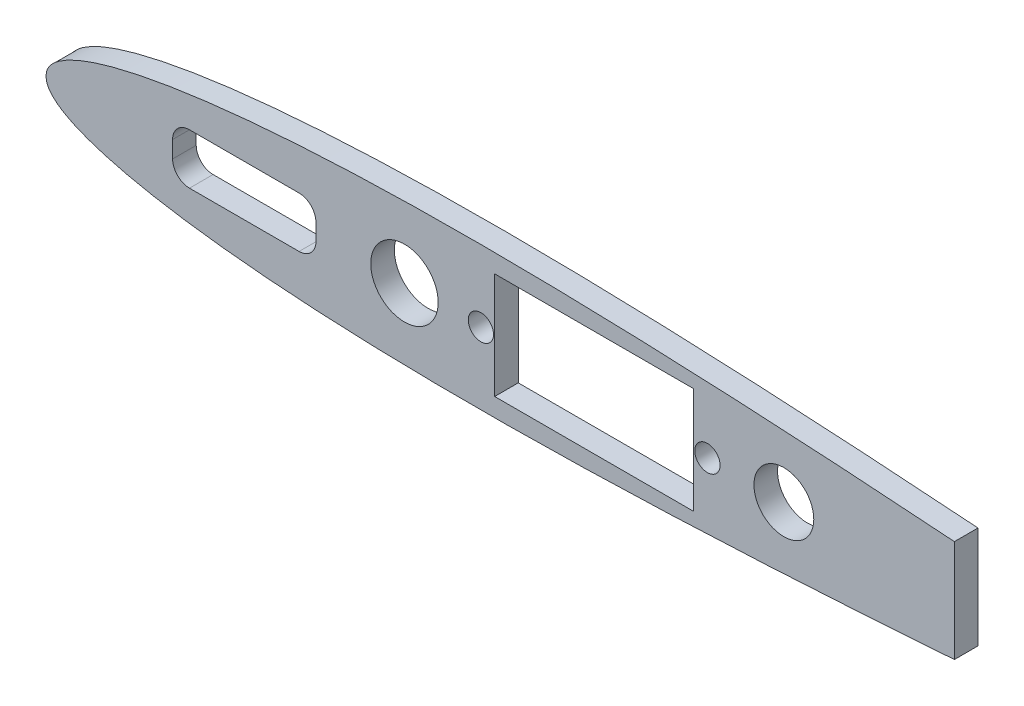
ISO-10303-21;
HEADER;
FILE_DESCRIPTION(('STEP AP214'),'2;1');
FILE_NAME('part.step','',(''),(''),'','','');
FILE_SCHEMA(('AUTOMOTIVE_DESIGN { 1 0 10303 214 1 1 1 1 }'));
ENDSEC;
DATA;
#1=APPLICATION_CONTEXT('core data for automotive mechanical design processes');
#2=APPLICATION_PROTOCOL_DEFINITION('international standard','automotive_design',2000,#1);
#3=PRODUCT_CONTEXT('',#1,'mechanical');
#4=PRODUCT('Part','Part','',(#3));
#5=PRODUCT_RELATED_PRODUCT_CATEGORY('part','',(#4));
#6=PRODUCT_DEFINITION_FORMATION('','',#4);
#7=PRODUCT_DEFINITION_CONTEXT('part definition',#1,'design');
#8=PRODUCT_DEFINITION('design','',#6,#7);
#9=PRODUCT_DEFINITION_SHAPE('','',#8);
#10=(LENGTH_UNIT() NAMED_UNIT(*) SI_UNIT(.MILLI.,.METRE.));
#11=(NAMED_UNIT(*) PLANE_ANGLE_UNIT() SI_UNIT($,.RADIAN.));
#12=(NAMED_UNIT(*) SI_UNIT($,.STERADIAN.) SOLID_ANGLE_UNIT());
#13=UNCERTAINTY_MEASURE_WITH_UNIT(LENGTH_MEASURE(1.E-05),#10,'distance_accuracy_value','');
#14=(GEOMETRIC_REPRESENTATION_CONTEXT(3) GLOBAL_UNCERTAINTY_ASSIGNED_CONTEXT((#13)) GLOBAL_UNIT_ASSIGNED_CONTEXT((#10,
#11,#12)) REPRESENTATION_CONTEXT('',''));
#15=CARTESIAN_POINT('',(0.,0.,0.));
#16=DIRECTION('',(0.,0.,1.));
#17=DIRECTION('',(1.,0.,0.));
#18=AXIS2_PLACEMENT_3D('',#15,#16,#17);
#19=CARTESIAN_POINT('',(217.74763411893,0.,1.4));
#20=DIRECTION('',(1.,0.,0.));
#21=DIRECTION('',(0.,0.,-1.));
#22=AXIS2_PLACEMENT_3D('',#19,#20,#21);
#23=PLANE('',#22);
#24=DIRECTION('',(0.,-1.,0.));
#25=VECTOR('',#24,1.);
#26=CARTESIAN_POINT('',(217.74763411893,0.,-1.4));
#27=LINE('',#26,#25);
#28=CARTESIAN_POINT('',(217.74763411893,6.05811307778919,-1.4));
#29=VERTEX_POINT('',#28);
#30=CARTESIAN_POINT('',(217.74763411893,-6.05811307778918,-1.4));
#31=VERTEX_POINT('',#30);
#32=EDGE_CURVE('E153',#29,#31,#27,.T.);
#33=ORIENTED_EDGE('',*,*,#32,.F.);
#34=DIRECTION('',(0.,0.,-1.));
#35=VECTOR('',#34,1.);
#36=CARTESIAN_POINT('',(217.74763411893,6.05811307778919,1.4));
#37=LINE('',#36,#35);
#38=CARTESIAN_POINT('',(217.74763411893,6.05811307778919,1.4));
#39=VERTEX_POINT('',#38);
#40=EDGE_CURVE('E11',#39,#29,#37,.T.);
#41=ORIENTED_EDGE('',*,*,#40,.F.);
#42=DIRECTION('',(0.,-1.,0.));
#43=VECTOR('',#42,1.);
#44=CARTESIAN_POINT('',(217.74763411893,0.,1.4));
#45=LINE('',#44,#43);
#46=CARTESIAN_POINT('',(217.74763411893,-6.05811307778918,1.4));
#47=VERTEX_POINT('',#46);
#48=EDGE_CURVE('E152',#39,#47,#45,.T.);
#49=ORIENTED_EDGE('',*,*,#48,.T.);
#50=DIRECTION('',(0.,0.,-1.));
#51=VECTOR('',#50,1.);
#52=CARTESIAN_POINT('',(217.74763411893,-6.05811307778918,1.4));
#53=LINE('',#52,#51);
#54=EDGE_CURVE('E110',#47,#31,#53,.T.);
#55=ORIENTED_EDGE('',*,*,#54,.T.);
#56=EDGE_LOOP('',(#33,#41,#49,#55));
#57=FACE_BOUND('',#56,.T.);
#58=ADVANCED_FACE('F35',(#57),#23,.T.);
#59=CARTESIAN_POINT('',(280.,0.1785,1.4));
#60=CARTESIAN_POINT('',(279.592043703671,0.226075897783467,1.4));
#61=CARTESIAN_POINT('',(278.452596210234,0.358958360844463,1.4));
#62=CARTESIAN_POINT('',(276.385426802208,0.596436481937331,1.4));
#63=CARTESIAN_POINT('',(273.651166983567,0.905304265461348,1.4));
#64=CARTESIAN_POINT('',(270.455833183168,1.25859090467058,1.4));
#65=CARTESIAN_POINT('',(266.898988861825,1.64260730411104,1.4));
#66=CARTESIAN_POINT('',(263.047743378214,2.04785660385741,1.4));
#67=CARTESIAN_POINT('',(258.952644661846,2.46718813772148,1.4));
#68=CARTESIAN_POINT('',(253.11611192075,3.04786904369115,1.4));
#69=CARTESIAN_POINT('',(247.071089235748,3.62220530992837,1.4));
#70=CARTESIAN_POINT('',(240.854179313273,4.18491264898859,1.4));
#71=CARTESIAN_POINT('',(236.038226964104,4.60581174883637,1.4));
#72=CARTESIAN_POINT('',(231.150377302514,5.0173511026198,1.4));
#73=CARTESIAN_POINT('',(226.209311113549,5.41695826474113,1.4));
#74=CARTESIAN_POINT('',(221.232257466585,5.802244474926,1.4));
#75=CARTESIAN_POINT('',(216.235178286272,6.17086457697306,1.4));
#76=CARTESIAN_POINT('',(211.232977593233,6.52047434958791,1.4));
#77=CARTESIAN_POINT('',(206.239642946259,6.84887299963153,1.4));
#78=CARTESIAN_POINT('',(201.268368916985,7.15382688632495,1.4));
#79=CARTESIAN_POINT('',(196.331634567492,7.43310533690328,1.4));
#80=CARTESIAN_POINT('',(191.441311474098,7.68460443906704,1.4));
#81=CARTESIAN_POINT('',(186.608700126931,7.90621829286941,1.4));
#82=CARTESIAN_POINT('',(181.844626933159,8.09595849303594,1.4));
#83=CARTESIAN_POINT('',(177.159453511195,8.25195768192942,1.4));
#84=CARTESIAN_POINT('',(172.563150271755,8.37248656398387,1.4));
#85=CARTESIAN_POINT('',(168.065295924147,8.45595366245417,1.4));
#86=CARTESIAN_POINT('',(163.675147454163,8.5010026998616,1.4));
#87=CARTESIAN_POINT('',(159.401643403725,8.50652296727326,1.4));
#88=CARTESIAN_POINT('',(155.253439755899,8.47152880790102,1.4));
#89=CARTESIAN_POINT('',(151.238917925322,8.39550607585732,1.4));
#90=CARTESIAN_POINT('',(147.366223919106,8.27798597685019,1.4));
#91=CARTESIAN_POINT('',(143.643266298458,8.11897556141504,1.4));
#92=CARTESIAN_POINT('',(140.077743555427,7.91867894287145,1.4));
#93=CARTESIAN_POINT('',(136.677139412155,7.67760454203032,1.4));
#94=CARTESIAN_POINT('',(133.44876289533,7.39648056861162,1.4));
#95=CARTESIAN_POINT('',(130.399721685833,7.07642431038863,1.4));
#96=CARTESIAN_POINT('',(127.536961088608,6.71865034112428,1.4));
#97=CARTESIAN_POINT('',(124.867245825052,6.32466607739586,1.4));
#98=CARTESIAN_POINT('',(122.397158973637,5.89612056643678,1.4));
#99=CARTESIAN_POINT('',(120.133109351335,5.43479747619412,1.4));
#100=CARTESIAN_POINT('',(118.081312132678,4.94256764101073,1.4));
#101=CARTESIAN_POINT('',(116.247665797811,4.42139238611828,1.4));
#102=CARTESIAN_POINT('',(114.637939719778,3.87306046577258,1.4));
#103=CARTESIAN_POINT('',(113.256788366372,3.29930923783808,1.4));
#104=CARTESIAN_POINT('',(112.109835923497,2.70130638754162,1.4));
#105=CARTESIAN_POINT('',(111.196336340545,2.07855523302877,1.4));
#106=CARTESIAN_POINT('',(110.530223641577,1.42706975809109,1.4));
#107=CARTESIAN_POINT('',(110.085538217979,0.734230220465984,1.4));
#108=CARTESIAN_POINT('',(110.027578175867,0.236721440142773,1.4));
#109=CARTESIAN_POINT('',(110.,0.,1.4));
#110=B_SPLINE_CURVE_WITH_KNOTS('',3,(#59,#60,#61,#62,#63,#64,#65,#66,#67,#68,#69,#70,#71,#72,
#73,#74,#75,#76,#77,#78,#79,#80,#81,#82,#83,#84,#85,#86,#87,#88,#89,#90,#91,#92,#93,#94,#95,#96,
#97,#98,#99,#100,#101,#102,#103,#104,#105,#106,#107,#108,#109),.UNSPECIFIED.,.F.,.F.,(4,1,1,1,1,
1,1,1,1,1,1,1,1,1,1,1,1,1,1,1,1,1,1,1,1,1,1,1,1,1,1,1,1,1,1,1,1,1,1,1,1,1,1,1,1,1,1,1,4),(0.,
0.00714472364101537,0.0199556607345446,0.0361960612227423,0.0550111837630616,0.0758789375062231,
0.0984288660950085,0.122375554002083,0.147487885417653,0.200459747132314,0.228005170188377,
0.256076453638138,0.284555151070125,0.31333276259982,0.342309553949656,0.371392651251454,
0.400495752426115,0.429537687145242,0.458441905920554,0.487136113386761,0.515551917136779,
0.543623846405843,0.571289984327897,0.598490809568145,0.625169613225281,0.651272029103837,
0.676746157949116,0.701541790883913,0.725611016556625,0.74890783507394,0.771387785068823,
0.793008138575143,0.813728032856974,0.833507815357633,0.852309696093785,0.870097310144046,
0.886835918069106,0.902492781713446,0.917037139140432,0.930441053860646,0.942679762162792,
0.953733567025024,0.963589785484808,0.97224701929817,0.979722225388436,0.986065145275041,
0.991385258303778,0.995900988803729,1.),.UNSPECIFIED.);
#111=DIRECTION('',(0.,0.,-1.));
#112=VECTOR('',#111,1.);
#113=SURFACE_OF_LINEAR_EXTRUSION('',#110,#112);
#114=CARTESIAN_POINT('',(280.,0.1785,-1.4));
#115=CARTESIAN_POINT('',(279.592043703671,0.226075897783467,-1.4));
#116=CARTESIAN_POINT('',(278.452596210234,0.358958360844463,-1.4));
#117=CARTESIAN_POINT('',(276.385426802208,0.596436481937331,-1.4));
#118=CARTESIAN_POINT('',(273.651166983567,0.905304265461348,-1.4));
#119=CARTESIAN_POINT('',(270.455833183168,1.25859090467058,-1.4));
#120=CARTESIAN_POINT('',(266.898988861825,1.64260730411104,-1.4));
#121=CARTESIAN_POINT('',(263.047743378214,2.04785660385741,-1.4));
#122=CARTESIAN_POINT('',(258.952644661846,2.46718813772148,-1.4));
#123=CARTESIAN_POINT('',(253.11611192075,3.04786904369115,-1.4));
#124=CARTESIAN_POINT('',(247.071089235748,3.62220530992837,-1.4));
#125=CARTESIAN_POINT('',(240.854179313273,4.18491264898859,-1.4));
#126=CARTESIAN_POINT('',(236.038226964104,4.60581174883637,-1.4));
#127=CARTESIAN_POINT('',(231.150377302514,5.0173511026198,-1.4));
#128=CARTESIAN_POINT('',(226.209311113549,5.41695826474113,-1.4));
#129=CARTESIAN_POINT('',(221.232257466585,5.802244474926,-1.4));
#130=CARTESIAN_POINT('',(216.235178286272,6.17086457697306,-1.4));
#131=CARTESIAN_POINT('',(211.232977593233,6.52047434958791,-1.4));
#132=CARTESIAN_POINT('',(206.239642946259,6.84887299963153,-1.4));
#133=CARTESIAN_POINT('',(201.268368916985,7.15382688632495,-1.4));
#134=CARTESIAN_POINT('',(196.331634567492,7.43310533690328,-1.4));
#135=CARTESIAN_POINT('',(191.441311474098,7.68460443906704,-1.4));
#136=CARTESIAN_POINT('',(186.608700126931,7.90621829286941,-1.4));
#137=CARTESIAN_POINT('',(181.844626933159,8.09595849303594,-1.4));
#138=CARTESIAN_POINT('',(177.159453511195,8.25195768192942,-1.4));
#139=CARTESIAN_POINT('',(172.563150271755,8.37248656398387,-1.4));
#140=CARTESIAN_POINT('',(168.065295924147,8.45595366245417,-1.4));
#141=CARTESIAN_POINT('',(163.675147454163,8.5010026998616,-1.4));
#142=CARTESIAN_POINT('',(159.401643403725,8.50652296727326,-1.4));
#143=CARTESIAN_POINT('',(155.253439755899,8.47152880790102,-1.4));
#144=CARTESIAN_POINT('',(151.238917925322,8.39550607585732,-1.4));
#145=CARTESIAN_POINT('',(147.366223919106,8.27798597685019,-1.4));
#146=CARTESIAN_POINT('',(143.643266298458,8.11897556141504,-1.4));
#147=CARTESIAN_POINT('',(140.077743555427,7.91867894287145,-1.4));
#148=CARTESIAN_POINT('',(136.677139412155,7.67760454203032,-1.4));
#149=CARTESIAN_POINT('',(133.44876289533,7.39648056861162,-1.4));
#150=CARTESIAN_POINT('',(130.399721685833,7.07642431038863,-1.4));
#151=CARTESIAN_POINT('',(127.536961088608,6.71865034112428,-1.4));
#152=CARTESIAN_POINT('',(124.867245825052,6.32466607739586,-1.4));
#153=CARTESIAN_POINT('',(122.397158973637,5.89612056643678,-1.4));
#154=CARTESIAN_POINT('',(120.133109351335,5.43479747619412,-1.4));
#155=CARTESIAN_POINT('',(118.081312132678,4.94256764101073,-1.4));
#156=CARTESIAN_POINT('',(116.247665797811,4.42139238611828,-1.4));
#157=CARTESIAN_POINT('',(114.637939719778,3.87306046577258,-1.4));
#158=CARTESIAN_POINT('',(113.256788366372,3.29930923783808,-1.4));
#159=CARTESIAN_POINT('',(112.109835923497,2.70130638754162,-1.4));
#160=CARTESIAN_POINT('',(111.196336340545,2.07855523302877,-1.4));
#161=CARTESIAN_POINT('',(110.530223641577,1.42706975809109,-1.4));
#162=CARTESIAN_POINT('',(110.085538217979,0.734230220465984,-1.4));
#163=CARTESIAN_POINT('',(110.027578175867,0.236721440142773,-1.4));
#164=CARTESIAN_POINT('',(110.,0.,-1.4));
#165=B_SPLINE_CURVE_WITH_KNOTS('',3,(#114,#115,#116,#117,#118,#119,#120,#121,#122,#123,#124,
#125,#126,#127,#128,#129,#130,#131,#132,#133,#134,#135,#136,#137,#138,#139,#140,#141,#142,#143,
#144,#145,#146,#147,#148,#149,#150,#151,#152,#153,#154,#155,#156,#157,#158,#159,#160,#161,#162,
#163,#164),.UNSPECIFIED.,.F.,.F.,(4,1,1,1,1,1,1,1,1,1,1,1,1,1,1,1,1,1,1,1,1,1,1,1,1,1,1,1,1,1,1,
1,1,1,1,1,1,1,1,1,1,1,1,1,1,1,1,1,4),(0.,0.00714472364101537,0.0199556607345446,
0.0361960612227423,0.0550111837630616,0.0758789375062231,0.0984288660950085,0.122375554002083,
0.147487885417653,0.200459747132314,0.228005170188377,0.256076453638138,0.284555151070125,
0.31333276259982,0.342309553949656,0.371392651251454,0.400495752426115,0.429537687145242,
0.458441905920554,0.487136113386761,0.515551917136779,0.543623846405843,0.571289984327897,
0.598490809568145,0.625169613225281,0.651272029103837,0.676746157949116,0.701541790883913,
0.725611016556625,0.74890783507394,0.771387785068823,0.793008138575143,0.813728032856974,
0.833507815357633,0.852309696093785,0.870097310144046,0.886835918069106,0.902492781713446,
0.917037139140432,0.930441053860646,0.942679762162792,0.953733567025024,0.963589785484808,
0.97224701929817,0.979722225388436,0.986065145275041,0.991385258303778,0.995900988803729,1.),.UNSPECIFIED.);
#166=CARTESIAN_POINT('',(110.,0.,-1.4));
#167=VERTEX_POINT('',#166);
#168=EDGE_CURVE('E298',#29,#167,#165,.T.);
#169=ORIENTED_EDGE('',*,*,#168,.T.);
#170=DIRECTION('',(0.,0.,-1.));
#171=VECTOR('',#170,1.);
#172=CARTESIAN_POINT('',(110.,0.,1.4));
#173=LINE('',#172,#171);
#174=CARTESIAN_POINT('',(110.,0.,1.4));
#175=VERTEX_POINT('',#174);
#176=EDGE_CURVE('E45',#175,#167,#173,.T.);
#177=ORIENTED_EDGE('',*,*,#176,.F.);
#178=EDGE_CURVE('E157',#39,#175,#110,.T.);
#179=ORIENTED_EDGE('',*,*,#178,.F.);
#180=ORIENTED_EDGE('',*,*,#40,.T.);
#181=EDGE_LOOP('',(#169,#177,#179,#180));
#182=FACE_BOUND('',#181,.T.);
#183=ADVANCED_FACE('F158',(#182),#113,.F.);
#184=CARTESIAN_POINT('',(0.,3.,1.4));
#185=DIRECTION('',(0.,1.,0.));
#186=DIRECTION('',(0.,0.,1.));
#187=AXIS2_PLACEMENT_3D('',#184,#185,#186);
#188=PLANE('',#187);
#189=DIRECTION('',(1.,0.,0.));
#190=VECTOR('',#189,1.);
#191=CARTESIAN_POINT('',(0.,3.,-1.4));
#192=LINE('',#191,#190);
#193=CARTESIAN_POINT('',(127.018484280221,3.,-1.4));
#194=VERTEX_POINT('',#193);
#195=CARTESIAN_POINT('',(140.018484280221,3.,-1.4));
#196=VERTEX_POINT('',#195);
#197=EDGE_CURVE('E276',#194,#196,#192,.T.);
#198=ORIENTED_EDGE('',*,*,#197,.T.);
#199=DIRECTION('',(0.,0.,-1.));
#200=VECTOR('',#199,1.);
#201=CARTESIAN_POINT('',(140.018484280221,3.,1.4));
#202=LINE('',#201,#200);
#203=CARTESIAN_POINT('',(140.018484280221,3.,1.4));
#204=VERTEX_POINT('',#203);
#205=EDGE_CURVE('E313',#204,#196,#202,.T.);
#206=ORIENTED_EDGE('',*,*,#205,.F.);
#207=DIRECTION('',(1.,0.,0.));
#208=VECTOR('',#207,1.);
#209=CARTESIAN_POINT('',(0.,3.,1.4));
#210=LINE('',#209,#208);
#211=CARTESIAN_POINT('',(127.018484280221,3.,1.4));
#212=VERTEX_POINT('',#211);
#213=EDGE_CURVE('E354',#212,#204,#210,.T.);
#214=ORIENTED_EDGE('',*,*,#213,.F.);
#215=DIRECTION('',(0.,0.,-1.));
#216=VECTOR('',#215,1.);
#217=CARTESIAN_POINT('',(127.018484280221,3.,1.4));
#218=LINE('',#217,#216);
#219=EDGE_CURVE('E315',#212,#194,#218,.T.);
#220=ORIENTED_EDGE('',*,*,#219,.T.);
#221=EDGE_LOOP('',(#198,#206,#214,#220));
#222=FACE_BOUND('',#221,.T.);
#223=ADVANCED_FACE('F181',(#222),#188,.F.);
#224=CARTESIAN_POINT('',(140.018484280221,1.,1.4));
#225=DIRECTION('',(0.,0.,-1.));
#226=DIRECTION('',(-1.,0.,0.));
#227=AXIS2_PLACEMENT_3D('',#224,#225,#226);
#228=CYLINDRICAL_SURFACE('',#227,2.);
#229=CARTESIAN_POINT('',(140.018484280221,1.,-1.4));
#230=DIRECTION('',(0.,0.,1.));
#231=DIRECTION('',(1.,0.,0.));
#232=AXIS2_PLACEMENT_3D('',#229,#230,#231);
#233=CIRCLE('',#232,2.);
#234=CARTESIAN_POINT('',(142.018484280221,0.999999999999986,-1.4));
#235=VERTEX_POINT('',#234);
#236=EDGE_CURVE('E279',#196,#235,#233,.F.);
#237=ORIENTED_EDGE('',*,*,#236,.T.);
#238=DIRECTION('',(0.,0.,-1.));
#239=VECTOR('',#238,1.);
#240=CARTESIAN_POINT('',(142.018484280221,0.999999999999986,1.4));
#241=LINE('',#240,#239);
#242=CARTESIAN_POINT('',(142.018484280221,0.999999999999986,1.4));
#243=VERTEX_POINT('',#242);
#244=EDGE_CURVE('E330',#243,#235,#241,.T.);
#245=ORIENTED_EDGE('',*,*,#244,.F.);
#246=CARTESIAN_POINT('',(140.018484280221,1.,1.4));
#247=DIRECTION('',(0.,0.,1.));
#248=DIRECTION('',(1.,0.,0.));
#249=AXIS2_PLACEMENT_3D('',#246,#247,#248);
#250=CIRCLE('',#249,2.);
#251=EDGE_CURVE('E364',#204,#243,#250,.F.);
#252=ORIENTED_EDGE('',*,*,#251,.F.);
#253=ORIENTED_EDGE('',*,*,#205,.T.);
#254=EDGE_LOOP('',(#237,#245,#252,#253));
#255=FACE_BOUND('',#254,.T.);
#256=ADVANCED_FACE('F212',(#255),#228,.F.);
#257=CARTESIAN_POINT('',(142.018484280221,0.,1.4));
#258=DIRECTION('',(-1.,0.,0.));
#259=DIRECTION('',(0.,0.,1.));
#260=AXIS2_PLACEMENT_3D('',#257,#258,#259);
#261=PLANE('',#260);
#262=DIRECTION('',(0.,1.,0.));
#263=VECTOR('',#262,1.);
#264=CARTESIAN_POINT('',(142.018484280221,0.,-1.4));
#265=LINE('',#264,#263);
#266=CARTESIAN_POINT('',(142.018484280221,-0.999999999999985,-1.4));
#267=VERTEX_POINT('',#266);
#268=EDGE_CURVE('E282',#267,#235,#265,.T.);
#269=ORIENTED_EDGE('',*,*,#268,.F.);
#270=DIRECTION('',(0.,0.,-1.));
#271=VECTOR('',#270,1.);
#272=CARTESIAN_POINT('',(142.018484280221,-0.999999999999985,1.4));
#273=LINE('',#272,#271);
#274=CARTESIAN_POINT('',(142.018484280221,-0.999999999999985,1.4));
#275=VERTEX_POINT('',#274);
#276=EDGE_CURVE('E328',#275,#267,#273,.T.);
#277=ORIENTED_EDGE('',*,*,#276,.F.);
#278=DIRECTION('',(0.,1.,0.));
#279=VECTOR('',#278,1.);
#280=CARTESIAN_POINT('',(142.018484280221,0.,1.4));
#281=LINE('',#280,#279);
#282=EDGE_CURVE('E366',#275,#243,#281,.T.);
#283=ORIENTED_EDGE('',*,*,#282,.T.);
#284=ORIENTED_EDGE('',*,*,#244,.T.);
#285=EDGE_LOOP('',(#269,#277,#283,#284));
#286=FACE_BOUND('',#285,.T.);
#287=ADVANCED_FACE('F208',(#286),#261,.T.);
#288=CARTESIAN_POINT('',(140.018484280221,-1.,1.4));
#289=DIRECTION('',(0.,0.,-1.));
#290=DIRECTION('',(-1.,0.,0.));
#291=AXIS2_PLACEMENT_3D('',#288,#289,#290);
#292=CYLINDRICAL_SURFACE('',#291,2.);
#293=CARTESIAN_POINT('',(140.018484280221,-1.,-1.4));
#294=DIRECTION('',(0.,0.,1.));
#295=DIRECTION('',(1.,0.,0.));
#296=AXIS2_PLACEMENT_3D('',#293,#294,#295);
#297=CIRCLE('',#296,2.);
#298=CARTESIAN_POINT('',(140.018484280221,-3.,-1.4));
#299=VERTEX_POINT('',#298);
#300=EDGE_CURVE('E285',#299,#267,#297,.T.);
#301=ORIENTED_EDGE('',*,*,#300,.F.);
#302=DIRECTION('',(0.,0.,-1.));
#303=VECTOR('',#302,1.);
#304=CARTESIAN_POINT('',(140.018484280221,-3.,1.4));
#305=LINE('',#304,#303);
#306=CARTESIAN_POINT('',(140.018484280221,-3.,1.4));
#307=VERTEX_POINT('',#306);
#308=EDGE_CURVE('E326',#307,#299,#305,.T.);
#309=ORIENTED_EDGE('',*,*,#308,.F.);
#310=CARTESIAN_POINT('',(140.018484280221,-1.,1.4));
#311=DIRECTION('',(0.,0.,1.));
#312=DIRECTION('',(1.,0.,0.));
#313=AXIS2_PLACEMENT_3D('',#310,#311,#312);
#314=CIRCLE('',#313,2.);
#315=EDGE_CURVE('E369',#307,#275,#314,.T.);
#316=ORIENTED_EDGE('',*,*,#315,.T.);
#317=ORIENTED_EDGE('',*,*,#276,.T.);
#318=EDGE_LOOP('',(#301,#309,#316,#317));
#319=FACE_BOUND('',#318,.T.);
#320=ADVANCED_FACE('F204',(#319),#292,.F.);
#321=CARTESIAN_POINT('',(0.,-3.,1.4));
#322=DIRECTION('',(0.,1.,0.));
#323=DIRECTION('',(0.,0.,1.));
#324=AXIS2_PLACEMENT_3D('',#321,#322,#323);
#325=PLANE('',#324);
#326=DIRECTION('',(1.,0.,0.));
#327=VECTOR('',#326,1.);
#328=CARTESIAN_POINT('',(0.,-3.,-1.4));
#329=LINE('',#328,#327);
#330=CARTESIAN_POINT('',(127.018484280221,-3.,-1.4));
#331=VERTEX_POINT('',#330);
#332=EDGE_CURVE('E288',#331,#299,#329,.T.);
#333=ORIENTED_EDGE('',*,*,#332,.F.);
#334=DIRECTION('',(0.,0.,-1.));
#335=VECTOR('',#334,1.);
#336=CARTESIAN_POINT('',(127.018484280221,-3.,1.4));
#337=LINE('',#336,#335);
#338=CARTESIAN_POINT('',(127.018484280221,-3.,1.4));
#339=VERTEX_POINT('',#338);
#340=EDGE_CURVE('E324',#339,#331,#337,.T.);
#341=ORIENTED_EDGE('',*,*,#340,.F.);
#342=DIRECTION('',(1.,0.,0.));
#343=VECTOR('',#342,1.);
#344=CARTESIAN_POINT('',(0.,-3.,1.4));
#345=LINE('',#344,#343);
#346=EDGE_CURVE('E372',#339,#307,#345,.T.);
#347=ORIENTED_EDGE('',*,*,#346,.T.);
#348=ORIENTED_EDGE('',*,*,#308,.T.);
#349=EDGE_LOOP('',(#333,#341,#347,#348));
#350=FACE_BOUND('',#349,.T.);
#351=ADVANCED_FACE('F200',(#350),#325,.T.);
#352=CARTESIAN_POINT('',(127.018484280221,-1.,1.4));
#353=DIRECTION('',(0.,0.,-1.));
#354=DIRECTION('',(-1.,0.,0.));
#355=AXIS2_PLACEMENT_3D('',#352,#353,#354);
#356=CYLINDRICAL_SURFACE('',#355,2.);
#357=CARTESIAN_POINT('',(127.018484280221,-1.,-1.4));
#358=DIRECTION('',(0.,0.,1.));
#359=DIRECTION('',(1.,0.,0.));
#360=AXIS2_PLACEMENT_3D('',#357,#358,#359);
#361=CIRCLE('',#360,2.);
#362=CARTESIAN_POINT('',(125.018484280221,-0.999999999999985,-1.4));
#363=VERTEX_POINT('',#362);
#364=EDGE_CURVE('E291',#331,#363,#361,.F.);
#365=ORIENTED_EDGE('',*,*,#364,.T.);
#366=DIRECTION('',(0.,0.,-1.));
#367=VECTOR('',#366,1.);
#368=CARTESIAN_POINT('',(125.018484280221,-0.999999999999985,1.4));
#369=LINE('',#368,#367);
#370=CARTESIAN_POINT('',(125.018484280221,-0.999999999999985,1.4));
#371=VERTEX_POINT('',#370);
#372=EDGE_CURVE('E321',#371,#363,#369,.T.);
#373=ORIENTED_EDGE('',*,*,#372,.F.);
#374=CARTESIAN_POINT('',(127.018484280221,-1.,1.4));
#375=DIRECTION('',(0.,0.,1.));
#376=DIRECTION('',(1.,0.,0.));
#377=AXIS2_PLACEMENT_3D('',#374,#375,#376);
#378=CIRCLE('',#377,2.);
#379=EDGE_CURVE('E375',#339,#371,#378,.F.);
#380=ORIENTED_EDGE('',*,*,#379,.F.);
#381=ORIENTED_EDGE('',*,*,#340,.T.);
#382=EDGE_LOOP('',(#365,#373,#380,#381));
#383=FACE_BOUND('',#382,.T.);
#384=ADVANCED_FACE('F196',(#383),#356,.F.);
#385=CARTESIAN_POINT('',(125.018484280221,0.,1.4));
#386=DIRECTION('',(-1.,0.,0.));
#387=DIRECTION('',(0.,0.,1.));
#388=AXIS2_PLACEMENT_3D('',#385,#386,#387);
#389=PLANE('',#388);
#390=DIRECTION('',(0.,1.,0.));
#391=VECTOR('',#390,1.);
#392=CARTESIAN_POINT('',(125.018484280221,0.,-1.4));
#393=LINE('',#392,#391);
#394=CARTESIAN_POINT('',(125.018484280221,0.999999999999986,-1.4));
#395=VERTEX_POINT('',#394);
#396=EDGE_CURVE('E293',#363,#395,#393,.T.);
#397=ORIENTED_EDGE('',*,*,#396,.T.);
#398=DIRECTION('',(0.,0.,-1.));
#399=VECTOR('',#398,1.);
#400=CARTESIAN_POINT('',(125.018484280221,0.999999999999986,1.4));
#401=LINE('',#400,#399);
#402=CARTESIAN_POINT('',(125.018484280221,0.999999999999986,1.4));
#403=VERTEX_POINT('',#402);
#404=EDGE_CURVE('E318',#403,#395,#401,.T.);
#405=ORIENTED_EDGE('',*,*,#404,.F.);
#406=DIRECTION('',(0.,1.,0.));
#407=VECTOR('',#406,1.);
#408=CARTESIAN_POINT('',(125.018484280221,0.,1.4));
#409=LINE('',#408,#407);
#410=EDGE_CURVE('E163',#371,#403,#409,.T.);
#411=ORIENTED_EDGE('',*,*,#410,.F.);
#412=ORIENTED_EDGE('',*,*,#372,.T.);
#413=EDGE_LOOP('',(#397,#405,#411,#412));
#414=FACE_BOUND('',#413,.T.);
#415=ADVANCED_FACE('F192',(#414),#389,.F.);
#416=CARTESIAN_POINT('',(186.818484280221,0.,1.4));
#417=DIRECTION('',(-1.,0.,0.));
#418=DIRECTION('',(0.,0.,1.));
#419=AXIS2_PLACEMENT_3D('',#416,#417,#418);
#420=PLANE('',#419);
#421=DIRECTION('',(0.,1.,0.));
#422=VECTOR('',#421,1.);
#423=CARTESIAN_POINT('',(186.818484280221,0.,-1.4));
#424=LINE('',#423,#422);
#425=CARTESIAN_POINT('',(186.818484280221,-6.3,-1.4));
#426=VERTEX_POINT('',#425);
#427=CARTESIAN_POINT('',(186.818484280221,6.3,-1.4));
#428=VERTEX_POINT('',#427);
#429=EDGE_CURVE('E264',#426,#428,#424,.T.);
#430=ORIENTED_EDGE('',*,*,#429,.F.);
#431=DIRECTION('',(0.,0.,-1.));
#432=VECTOR('',#431,1.);
#433=CARTESIAN_POINT('',(186.818484280221,-6.3,1.4));
#434=LINE('',#433,#432);
#435=CARTESIAN_POINT('',(186.818484280221,-6.3,1.4));
#436=VERTEX_POINT('',#435);
#437=EDGE_CURVE('E39',#436,#426,#434,.T.);
#438=ORIENTED_EDGE('',*,*,#437,.F.);
#439=DIRECTION('',(0.,1.,0.));
#440=VECTOR('',#439,1.);
#441=CARTESIAN_POINT('',(186.818484280221,0.,1.4));
#442=LINE('',#441,#440);
#443=CARTESIAN_POINT('',(186.818484280221,6.3,1.4));
#444=VERTEX_POINT('',#443);
#445=EDGE_CURVE('E358',#436,#444,#442,.T.);
#446=ORIENTED_EDGE('',*,*,#445,.T.);
#447=DIRECTION('',(0.,0.,-1.));
#448=VECTOR('',#447,1.);
#449=CARTESIAN_POINT('',(186.818484280221,6.3,1.4));
#450=LINE('',#449,#448);
#451=EDGE_CURVE('E334',#444,#428,#450,.T.);
#452=ORIENTED_EDGE('',*,*,#451,.T.);
#453=EDGE_LOOP('',(#430,#438,#446,#452));
#454=FACE_BOUND('',#453,.T.);
#455=ADVANCED_FACE('F195',(#454),#420,.T.);
#456=CARTESIAN_POINT('',(0.,-6.3,1.4));
#457=DIRECTION('',(0.,1.,0.));
#458=DIRECTION('',(0.,0.,1.));
#459=AXIS2_PLACEMENT_3D('',#456,#457,#458);
#460=PLANE('',#459);
#461=DIRECTION('',(1.,0.,0.));
#462=VECTOR('',#461,1.);
#463=CARTESIAN_POINT('',(0.,-6.3,-1.4));
#464=LINE('',#463,#462);
#465=CARTESIAN_POINT('',(163.218484280221,-6.3,-1.4));
#466=VERTEX_POINT('',#465);
#467=EDGE_CURVE('E267',#466,#426,#464,.T.);
#468=ORIENTED_EDGE('',*,*,#467,.F.);
#469=DIRECTION('',(0.,0.,-1.));
#470=VECTOR('',#469,1.);
#471=CARTESIAN_POINT('',(163.218484280221,-6.3,1.4));
#472=LINE('',#471,#470);
#473=CARTESIAN_POINT('',(163.218484280221,-6.3,1.4));
#474=VERTEX_POINT('',#473);
#475=EDGE_CURVE('E338',#474,#466,#472,.T.);
#476=ORIENTED_EDGE('',*,*,#475,.F.);
#477=DIRECTION('',(1.,0.,0.));
#478=VECTOR('',#477,1.);
#479=CARTESIAN_POINT('',(0.,-6.3,1.4));
#480=LINE('',#479,#478);
#481=EDGE_CURVE('E344',#474,#436,#480,.T.);
#482=ORIENTED_EDGE('',*,*,#481,.T.);
#483=ORIENTED_EDGE('',*,*,#437,.T.);
#484=EDGE_LOOP('',(#468,#476,#482,#483));
#485=FACE_BOUND('',#484,.T.);
#486=ADVANCED_FACE('F226',(#485),#460,.T.);
#487=CARTESIAN_POINT('',(163.218484280221,0.,1.4));
#488=DIRECTION('',(-1.,0.,0.));
#489=DIRECTION('',(0.,0.,1.));
#490=AXIS2_PLACEMENT_3D('',#487,#488,#489);
#491=PLANE('',#490);
#492=DIRECTION('',(0.,1.,0.));
#493=VECTOR('',#492,1.);
#494=CARTESIAN_POINT('',(163.218484280221,0.,-1.4));
#495=LINE('',#494,#493);
#496=CARTESIAN_POINT('',(163.218484280221,6.3,-1.4));
#497=VERTEX_POINT('',#496);
#498=EDGE_CURVE('E270',#466,#497,#495,.T.);
#499=ORIENTED_EDGE('',*,*,#498,.T.);
#500=DIRECTION('',(0.,0.,-1.));
#501=VECTOR('',#500,1.);
#502=CARTESIAN_POINT('',(163.218484280221,6.3,1.4));
#503=LINE('',#502,#501);
#504=CARTESIAN_POINT('',(163.218484280221,6.3,1.4));
#505=VERTEX_POINT('',#504);
#506=EDGE_CURVE('E336',#505,#497,#503,.T.);
#507=ORIENTED_EDGE('',*,*,#506,.F.);
#508=DIRECTION('',(0.,1.,0.));
#509=VECTOR('',#508,1.);
#510=CARTESIAN_POINT('',(163.218484280221,0.,1.4));
#511=LINE('',#510,#509);
#512=EDGE_CURVE('E351',#474,#505,#511,.T.);
#513=ORIENTED_EDGE('',*,*,#512,.F.);
#514=ORIENTED_EDGE('',*,*,#475,.T.);
#515=EDGE_LOOP('',(#499,#507,#513,#514));
#516=FACE_BOUND('',#515,.T.);
#517=ADVANCED_FACE('F190',(#516),#491,.F.);
#518=CARTESIAN_POINT('',(127.018484280221,1.,1.4));
#519=DIRECTION('',(0.,0.,-1.));
#520=DIRECTION('',(-1.,0.,0.));
#521=AXIS2_PLACEMENT_3D('',#518,#519,#520);
#522=CYLINDRICAL_SURFACE('',#521,2.);
#523=CARTESIAN_POINT('',(127.018484280221,1.,-1.4));
#524=DIRECTION('',(0.,0.,1.));
#525=DIRECTION('',(1.,0.,0.));
#526=AXIS2_PLACEMENT_3D('',#523,#524,#525);
#527=CIRCLE('',#526,2.);
#528=EDGE_CURVE('E295',#395,#194,#527,.F.);
#529=ORIENTED_EDGE('',*,*,#528,.T.);
#530=ORIENTED_EDGE('',*,*,#219,.F.);
#531=CARTESIAN_POINT('',(127.018484280221,1.,1.4));
#532=DIRECTION('',(0.,0.,1.));
#533=DIRECTION('',(1.,0.,0.));
#534=AXIS2_PLACEMENT_3D('',#531,#532,#533);
#535=CIRCLE('',#534,2.);
#536=EDGE_CURVE('E161',#403,#212,#535,.F.);
#537=ORIENTED_EDGE('',*,*,#536,.F.);
#538=ORIENTED_EDGE('',*,*,#404,.T.);
#539=EDGE_LOOP('',(#529,#530,#537,#538));
#540=FACE_BOUND('',#539,.T.);
#541=ADVANCED_FACE('F186',(#540),#522,.F.);
#542=CARTESIAN_POINT('',(0.,6.3,1.4));
#543=DIRECTION('',(0.,1.,0.));
#544=DIRECTION('',(0.,0.,1.));
#545=AXIS2_PLACEMENT_3D('',#542,#543,#544);
#546=PLANE('',#545);
#547=DIRECTION('',(1.,0.,0.));
#548=VECTOR('',#547,1.);
#549=CARTESIAN_POINT('',(0.,6.3,-1.4));
#550=LINE('',#549,#548);
#551=EDGE_CURVE('E273',#497,#428,#550,.T.);
#552=ORIENTED_EDGE('',*,*,#551,.T.);
#553=ORIENTED_EDGE('',*,*,#451,.F.);
#554=DIRECTION('',(1.,0.,0.));
#555=VECTOR('',#554,1.);
#556=CARTESIAN_POINT('',(0.,6.3,1.4));
#557=LINE('',#556,#555);
#558=EDGE_CURVE('E352',#505,#444,#557,.T.);
#559=ORIENTED_EDGE('',*,*,#558,.F.);
#560=ORIENTED_EDGE('',*,*,#506,.T.);
#561=EDGE_LOOP('',(#552,#553,#559,#560));
#562=FACE_BOUND('',#561,.T.);
#563=ADVANCED_FACE('F189',(#562),#546,.F.);
#564=CARTESIAN_POINT('',(152.518484280221,0.,1.4));
#565=DIRECTION('',(0.,0.,-1.));
#566=DIRECTION('',(-1.,0.,0.));
#567=AXIS2_PLACEMENT_3D('',#564,#565,#566);
#568=CYLINDRICAL_SURFACE('',#567,3.99999999999999);
#569=CARTESIAN_POINT('',(152.518484280221,0.,1.4));
#570=DIRECTION('',(0.,0.,1.));
#571=DIRECTION('',(1.,0.,0.));
#572=AXIS2_PLACEMENT_3D('',#569,#570,#571);
#573=CIRCLE('',#572,3.99999999999999);
#574=CARTESIAN_POINT('',(156.518484280221,0.,1.4));
#575=VERTEX_POINT('',#574);
#576=EDGE_CURVE('E424',#575,#575,#573,.T.);
#577=ORIENTED_EDGE('',*,*,#576,.T.);
#578=EDGE_LOOP('',(#577));
#579=FACE_BOUND('',#578,.T.);
#580=CARTESIAN_POINT('',(152.518484280221,0.,-1.4));
#581=DIRECTION('',(0.,0.,1.));
#582=DIRECTION('',(1.,0.,0.));
#583=AXIS2_PLACEMENT_3D('',#580,#581,#582);
#584=CIRCLE('',#583,3.99999999999999);
#585=CARTESIAN_POINT('',(156.518484280221,0.,-1.4));
#586=VERTEX_POINT('',#585);
#587=EDGE_CURVE('E258',#586,#586,#584,.T.);
#588=ORIENTED_EDGE('',*,*,#587,.F.);
#589=EDGE_LOOP('',(#588));
#590=FACE_BOUND('',#589,.T.);
#591=ADVANCED_FACE('F222',(#579,#590),#568,.F.);
#592=CARTESIAN_POINT('',(197.518484280221,0.,1.4));
#593=DIRECTION('',(0.,0.,-1.));
#594=DIRECTION('',(-1.,0.,0.));
#595=AXIS2_PLACEMENT_3D('',#592,#593,#594);
#596=CYLINDRICAL_SURFACE('',#595,3.54999999999999);
#597=CARTESIAN_POINT('',(197.518484280221,0.,1.4));
#598=DIRECTION('',(0.,0.,1.));
#599=DIRECTION('',(1.,0.,0.));
#600=AXIS2_PLACEMENT_3D('',#597,#598,#599);
#601=CIRCLE('',#600,3.54999999999999);
#602=CARTESIAN_POINT('',(201.068484280221,0.,1.4));
#603=VERTEX_POINT('',#602);
#604=EDGE_CURVE('E421',#603,#603,#601,.T.);
#605=ORIENTED_EDGE('',*,*,#604,.T.);
#606=EDGE_LOOP('',(#605));
#607=FACE_BOUND('',#606,.T.);
#608=CARTESIAN_POINT('',(197.518484280221,0.,-1.4));
#609=DIRECTION('',(0.,0.,1.));
#610=DIRECTION('',(1.,0.,0.));
#611=AXIS2_PLACEMENT_3D('',#608,#609,#610);
#612=CIRCLE('',#611,3.54999999999999);
#613=CARTESIAN_POINT('',(201.068484280221,0.,-1.4));
#614=VERTEX_POINT('',#613);
#615=EDGE_CURVE('E254',#614,#614,#612,.T.);
#616=ORIENTED_EDGE('',*,*,#615,.F.);
#617=EDGE_LOOP('',(#616));
#618=FACE_BOUND('',#617,.T.);
#619=ADVANCED_FACE('F235',(#607,#618),#596,.F.);
#620=CARTESIAN_POINT('',(188.453484280221,0.,1.4));
#621=DIRECTION('',(0.,0.,-1.));
#622=DIRECTION('',(-1.,0.,0.));
#623=AXIS2_PLACEMENT_3D('',#620,#621,#622);
#624=CYLINDRICAL_SURFACE('',#623,1.5);
#625=CARTESIAN_POINT('',(188.453484280221,0.,1.4));
#626=DIRECTION('',(0.,0.,1.));
#627=DIRECTION('',(1.,0.,0.));
#628=AXIS2_PLACEMENT_3D('',#625,#626,#627);
#629=CIRCLE('',#628,1.5);
#630=CARTESIAN_POINT('',(189.953484280221,0.,1.4));
#631=VERTEX_POINT('',#630);
#632=EDGE_CURVE('E249',#631,#631,#629,.T.);
#633=ORIENTED_EDGE('',*,*,#632,.T.);
#634=EDGE_LOOP('',(#633));
#635=FACE_BOUND('',#634,.T.);
#636=CARTESIAN_POINT('',(188.453484280221,0.,-1.4));
#637=DIRECTION('',(0.,0.,1.));
#638=DIRECTION('',(1.,0.,0.));
#639=AXIS2_PLACEMENT_3D('',#636,#637,#638);
#640=CIRCLE('',#639,1.5);
#641=CARTESIAN_POINT('',(189.953484280221,0.,-1.4));
#642=VERTEX_POINT('',#641);
#643=EDGE_CURVE('E252',#642,#642,#640,.T.);
#644=ORIENTED_EDGE('',*,*,#643,.F.);
#645=EDGE_LOOP('',(#644));
#646=FACE_BOUND('',#645,.T.);
#647=ADVANCED_FACE('F238',(#635,#646),#624,.F.);
#648=CARTESIAN_POINT('',(161.583484280221,0.,1.4));
#649=DIRECTION('',(0.,0.,-1.));
#650=DIRECTION('',(-1.,0.,0.));
#651=AXIS2_PLACEMENT_3D('',#648,#649,#650);
#652=CYLINDRICAL_SURFACE('',#651,1.5);
#653=CARTESIAN_POINT('',(161.583484280221,0.,1.4));
#654=DIRECTION('',(0.,0.,1.));
#655=DIRECTION('',(1.,0.,0.));
#656=AXIS2_PLACEMENT_3D('',#653,#654,#655);
#657=CIRCLE('',#656,1.5);
#658=CARTESIAN_POINT('',(163.083484280221,0.,1.4));
#659=VERTEX_POINT('',#658);
#660=EDGE_CURVE('E308',#659,#659,#657,.F.);
#661=ORIENTED_EDGE('',*,*,#660,.F.);
#662=EDGE_LOOP('',(#661));
#663=FACE_BOUND('',#662,.T.);
#664=CARTESIAN_POINT('',(161.583484280221,0.,-1.4));
#665=DIRECTION('',(0.,0.,1.));
#666=DIRECTION('',(1.,0.,0.));
#667=AXIS2_PLACEMENT_3D('',#664,#665,#666);
#668=CIRCLE('',#667,1.5);
#669=CARTESIAN_POINT('',(163.083484280221,0.,-1.4));
#670=VERTEX_POINT('',#669);
#671=EDGE_CURVE('E255',#670,#670,#668,.F.);
#672=ORIENTED_EDGE('',*,*,#671,.T.);
#673=EDGE_LOOP('',(#672));
#674=FACE_BOUND('',#673,.T.);
#675=ADVANCED_FACE('F37',(#663,#674),#652,.F.);
#676=CARTESIAN_POINT('',(110.,0.,1.4));
#677=CARTESIAN_POINT('',(110.027578175867,-0.236721440142772,1.4));
#678=CARTESIAN_POINT('',(110.085538217979,-0.734230220465975,1.4));
#679=CARTESIAN_POINT('',(110.530223641577,-1.42706975809109,1.4));
#680=CARTESIAN_POINT('',(111.196336340545,-2.07855523302878,1.4));
#681=CARTESIAN_POINT('',(112.109835923497,-2.70130638754161,1.4));
#682=CARTESIAN_POINT('',(113.256788366372,-3.29930923783809,1.4));
#683=CARTESIAN_POINT('',(114.637939719778,-3.87306046577258,1.4));
#684=CARTESIAN_POINT('',(116.24766579781,-4.42139238611828,1.4));
#685=CARTESIAN_POINT('',(118.081312132678,-4.94256764101073,1.4));
#686=CARTESIAN_POINT('',(120.133109351335,-5.43479747619412,1.4));
#687=CARTESIAN_POINT('',(122.397158973637,-5.89612056643677,1.4));
#688=CARTESIAN_POINT('',(124.867245825052,-6.32466607739586,1.4));
#689=CARTESIAN_POINT('',(127.536961088608,-6.71865034112428,1.4));
#690=CARTESIAN_POINT('',(130.399721685833,-7.07642431038863,1.4));
#691=CARTESIAN_POINT('',(133.44876289533,-7.39648056861162,1.4));
#692=CARTESIAN_POINT('',(136.677139412155,-7.67760454203032,1.4));
#693=CARTESIAN_POINT('',(140.077743555427,-7.91867894287145,1.4));
#694=CARTESIAN_POINT('',(143.643266298458,-8.11897556141504,1.4));
#695=CARTESIAN_POINT('',(147.366223919106,-8.27798597685019,1.4));
#696=CARTESIAN_POINT('',(151.238917925322,-8.39550607585732,1.4));
#697=CARTESIAN_POINT('',(155.253439755899,-8.47152880790102,1.4));
#698=CARTESIAN_POINT('',(159.401643403725,-8.50652296727325,1.4));
#699=CARTESIAN_POINT('',(163.675147454163,-8.5010026998616,1.4));
#700=CARTESIAN_POINT('',(168.065295924147,-8.45595366245417,1.4));
#701=CARTESIAN_POINT('',(172.563150271755,-8.37248656398386,1.4));
#702=CARTESIAN_POINT('',(177.159453511195,-8.25195768192942,1.4));
#703=CARTESIAN_POINT('',(181.844626933159,-8.09595849303594,1.4));
#704=CARTESIAN_POINT('',(186.60870012693,-7.90621829286941,1.4));
#705=CARTESIAN_POINT('',(191.441311474098,-7.68460443906704,1.4));
#706=CARTESIAN_POINT('',(196.331634567492,-7.43310533690328,1.4));
#707=CARTESIAN_POINT('',(201.268368916985,-7.15382688632495,1.4));
#708=CARTESIAN_POINT('',(206.239642946259,-6.84887299963153,1.4));
#709=CARTESIAN_POINT('',(211.232977593233,-6.52047434958792,1.4));
#710=CARTESIAN_POINT('',(216.235178286271,-6.17086457697306,1.4));
#711=CARTESIAN_POINT('',(221.232257466585,-5.802244474926,1.4));
#712=CARTESIAN_POINT('',(226.209311113548,-5.41695826474113,1.4));
#713=CARTESIAN_POINT('',(231.150377302515,-5.0173511026198,1.4));
#714=CARTESIAN_POINT('',(236.038226964104,-4.60581174883637,1.4));
#715=CARTESIAN_POINT('',(240.854179313273,-4.18491264898859,1.4));
#716=CARTESIAN_POINT('',(247.071089235748,-3.62220530992837,1.4));
#717=CARTESIAN_POINT('',(253.11611192075,-3.04786904369115,1.4));
#718=CARTESIAN_POINT('',(258.952644661846,-2.46718813772147,1.4));
#719=CARTESIAN_POINT('',(263.047743378214,-2.04785660385741,1.4));
#720=CARTESIAN_POINT('',(266.898988861825,-1.64260730411104,1.4));
#721=CARTESIAN_POINT('',(270.455833183168,-1.25859090467058,1.4));
#722=CARTESIAN_POINT('',(273.651166983567,-0.905304265461349,1.4));
#723=CARTESIAN_POINT('',(276.385426802208,-0.59643648193733,1.4));
#724=CARTESIAN_POINT('',(278.452596210234,-0.358958360844466,1.4));
#725=CARTESIAN_POINT('',(279.592043703671,-0.226075897783468,1.4));
#726=CARTESIAN_POINT('',(280.,-0.1785,1.4));
#727=B_SPLINE_CURVE_WITH_KNOTS('',3,(#676,#677,#678,#679,#680,#681,#682,#683,#684,#685,#686,
#687,#688,#689,#690,#691,#692,#693,#694,#695,#696,#697,#698,#699,#700,#701,#702,#703,#704,#705,
#706,#707,#708,#709,#710,#711,#712,#713,#714,#715,#716,#717,#718,#719,#720,#721,#722,#723,#724,
#725,#726),.UNSPECIFIED.,.F.,.F.,(4,1,1,1,1,1,1,1,1,1,1,1,1,1,1,1,1,1,1,1,1,1,1,1,1,1,1,1,1,1,1,
1,1,1,1,1,1,1,1,1,1,1,1,1,1,1,1,1,4),(0.,0.00409901119627066,0.00861474169622249,
0.013934854724959,0.0202777746115639,0.0277529807018305,0.0364102145151919,0.0462664329749759,
0.057320237837208,0.0695589461393541,0.0829628608595683,0.0975072182865541,0.113164081930894,
0.129902689855954,0.147690303906216,0.166492184642367,0.186271967143026,0.206991861424858,
0.228612214931177,0.25109216492606,0.274388983443375,0.298458209116087,0.323253842050884,
0.348727970896163,0.374830386774719,0.401509190431855,0.428710015672103,0.456376153594157,
0.484448082863221,0.512863886613239,0.541558094079446,0.570462312854758,0.599504247573885,
0.628607348748546,0.657690446050344,0.68666723740018,0.715444848929875,0.743923546361862,
0.771994829811623,0.799540252867686,0.852512114582347,0.877624445997917,0.901571133904992,
0.924121062493777,0.944988816236938,0.963803938777258,0.980044339265455,0.992855276358985,1.),.UNSPECIFIED.);
#728=DIRECTION('',(0.,0.,-1.));
#729=VECTOR('',#728,1.);
#730=SURFACE_OF_LINEAR_EXTRUSION('',#727,#729);
#731=CARTESIAN_POINT('',(110.,0.,-1.4));
#732=CARTESIAN_POINT('',(110.027578175867,-0.236721440142772,-1.4));
#733=CARTESIAN_POINT('',(110.085538217979,-0.734230220465975,-1.4));
#734=CARTESIAN_POINT('',(110.530223641577,-1.42706975809109,-1.4));
#735=CARTESIAN_POINT('',(111.196336340545,-2.07855523302878,-1.4));
#736=CARTESIAN_POINT('',(112.109835923497,-2.70130638754161,-1.4));
#737=CARTESIAN_POINT('',(113.256788366372,-3.29930923783809,-1.4));
#738=CARTESIAN_POINT('',(114.637939719778,-3.87306046577258,-1.4));
#739=CARTESIAN_POINT('',(116.24766579781,-4.42139238611828,-1.4));
#740=CARTESIAN_POINT('',(118.081312132678,-4.94256764101073,-1.4));
#741=CARTESIAN_POINT('',(120.133109351335,-5.43479747619412,-1.4));
#742=CARTESIAN_POINT('',(122.397158973637,-5.89612056643677,-1.4));
#743=CARTESIAN_POINT('',(124.867245825052,-6.32466607739586,-1.4));
#744=CARTESIAN_POINT('',(127.536961088608,-6.71865034112428,-1.4));
#745=CARTESIAN_POINT('',(130.399721685833,-7.07642431038863,-1.4));
#746=CARTESIAN_POINT('',(133.44876289533,-7.39648056861162,-1.4));
#747=CARTESIAN_POINT('',(136.677139412155,-7.67760454203032,-1.4));
#748=CARTESIAN_POINT('',(140.077743555427,-7.91867894287145,-1.4));
#749=CARTESIAN_POINT('',(143.643266298458,-8.11897556141504,-1.4));
#750=CARTESIAN_POINT('',(147.366223919106,-8.27798597685019,-1.4));
#751=CARTESIAN_POINT('',(151.238917925322,-8.39550607585732,-1.4));
#752=CARTESIAN_POINT('',(155.253439755899,-8.47152880790102,-1.4));
#753=CARTESIAN_POINT('',(159.401643403725,-8.50652296727325,-1.4));
#754=CARTESIAN_POINT('',(163.675147454163,-8.5010026998616,-1.4));
#755=CARTESIAN_POINT('',(168.065295924147,-8.45595366245417,-1.4));
#756=CARTESIAN_POINT('',(172.563150271755,-8.37248656398386,-1.4));
#757=CARTESIAN_POINT('',(177.159453511195,-8.25195768192942,-1.4));
#758=CARTESIAN_POINT('',(181.844626933159,-8.09595849303594,-1.4));
#759=CARTESIAN_POINT('',(186.60870012693,-7.90621829286941,-1.4));
#760=CARTESIAN_POINT('',(191.441311474098,-7.68460443906704,-1.4));
#761=CARTESIAN_POINT('',(196.331634567492,-7.43310533690328,-1.4));
#762=CARTESIAN_POINT('',(201.268368916985,-7.15382688632495,-1.4));
#763=CARTESIAN_POINT('',(206.239642946259,-6.84887299963153,-1.4));
#764=CARTESIAN_POINT('',(211.232977593233,-6.52047434958792,-1.4));
#765=CARTESIAN_POINT('',(216.235178286271,-6.17086457697306,-1.4));
#766=CARTESIAN_POINT('',(221.232257466585,-5.802244474926,-1.4));
#767=CARTESIAN_POINT('',(226.209311113548,-5.41695826474113,-1.4));
#768=CARTESIAN_POINT('',(231.150377302515,-5.0173511026198,-1.4));
#769=CARTESIAN_POINT('',(236.038226964104,-4.60581174883637,-1.4));
#770=CARTESIAN_POINT('',(240.854179313273,-4.18491264898859,-1.4));
#771=CARTESIAN_POINT('',(247.071089235748,-3.62220530992837,-1.4));
#772=CARTESIAN_POINT('',(253.11611192075,-3.04786904369115,-1.4));
#773=CARTESIAN_POINT('',(258.952644661846,-2.46718813772147,-1.4));
#774=CARTESIAN_POINT('',(263.047743378214,-2.04785660385741,-1.4));
#775=CARTESIAN_POINT('',(266.898988861825,-1.64260730411104,-1.4));
#776=CARTESIAN_POINT('',(270.455833183168,-1.25859090467058,-1.4));
#777=CARTESIAN_POINT('',(273.651166983567,-0.905304265461349,-1.4));
#778=CARTESIAN_POINT('',(276.385426802208,-0.59643648193733,-1.4));
#779=CARTESIAN_POINT('',(278.452596210234,-0.358958360844466,-1.4));
#780=CARTESIAN_POINT('',(279.592043703671,-0.226075897783468,-1.4));
#781=CARTESIAN_POINT('',(280.,-0.1785,-1.4));
#782=B_SPLINE_CURVE_WITH_KNOTS('',3,(#731,#732,#733,#734,#735,#736,#737,#738,#739,#740,#741,
#742,#743,#744,#745,#746,#747,#748,#749,#750,#751,#752,#753,#754,#755,#756,#757,#758,#759,#760,
#761,#762,#763,#764,#765,#766,#767,#768,#769,#770,#771,#772,#773,#774,#775,#776,#777,#778,#779,
#780,#781),.UNSPECIFIED.,.F.,.F.,(4,1,1,1,1,1,1,1,1,1,1,1,1,1,1,1,1,1,1,1,1,1,1,1,1,1,1,1,1,1,1,
1,1,1,1,1,1,1,1,1,1,1,1,1,1,1,1,1,4),(0.,0.00409901119627066,0.00861474169622249,
0.013934854724959,0.0202777746115639,0.0277529807018305,0.0364102145151919,0.0462664329749759,
0.057320237837208,0.0695589461393541,0.0829628608595683,0.0975072182865541,0.113164081930894,
0.129902689855954,0.147690303906216,0.166492184642367,0.186271967143026,0.206991861424858,
0.228612214931177,0.25109216492606,0.274388983443375,0.298458209116087,0.323253842050884,
0.348727970896163,0.374830386774719,0.401509190431855,0.428710015672103,0.456376153594157,
0.484448082863221,0.512863886613239,0.541558094079446,0.570462312854758,0.599504247573885,
0.628607348748546,0.657690446050344,0.68666723740018,0.715444848929875,0.743923546361862,
0.771994829811623,0.799540252867686,0.852512114582347,0.877624445997917,0.901571133904992,
0.924121062493777,0.944988816236938,0.963803938777258,0.980044339265455,0.992855276358985,1.),.UNSPECIFIED.);
#783=EDGE_CURVE('E103',#167,#31,#782,.T.);
#784=ORIENTED_EDGE('',*,*,#783,.T.);
#785=ORIENTED_EDGE('',*,*,#54,.F.);
#786=EDGE_CURVE('E54',#175,#47,#727,.T.);
#787=ORIENTED_EDGE('',*,*,#786,.F.);
#788=ORIENTED_EDGE('',*,*,#176,.T.);
#789=EDGE_LOOP('',(#784,#785,#787,#788));
#790=FACE_BOUND('',#789,.T.);
#791=ADVANCED_FACE('F182',(#790),#730,.F.);
#792=CARTESIAN_POINT('',(0.,0.,1.4));
#793=DIRECTION('',(0.,0.,1.));
#794=DIRECTION('',(1.,0.,0.));
#795=AXIS2_PLACEMENT_3D('',#792,#793,#794);
#796=PLANE('',#795);
#797=ORIENTED_EDGE('',*,*,#660,.T.);
#798=EDGE_LOOP('',(#797));
#799=FACE_BOUND('',#798,.T.);
#800=ORIENTED_EDGE('',*,*,#632,.F.);
#801=EDGE_LOOP('',(#800));
#802=FACE_BOUND('',#801,.T.);
#803=ORIENTED_EDGE('',*,*,#604,.F.);
#804=EDGE_LOOP('',(#803));
#805=FACE_BOUND('',#804,.T.);
#806=ORIENTED_EDGE('',*,*,#576,.F.);
#807=EDGE_LOOP('',(#806));
#808=FACE_BOUND('',#807,.T.);
#809=ORIENTED_EDGE('',*,*,#445,.F.);
#810=ORIENTED_EDGE('',*,*,#481,.F.);
#811=ORIENTED_EDGE('',*,*,#512,.T.);
#812=ORIENTED_EDGE('',*,*,#558,.T.);
#813=EDGE_LOOP('',(#809,#810,#811,#812));
#814=FACE_BOUND('',#813,.T.);
#815=ORIENTED_EDGE('',*,*,#213,.T.);
#816=ORIENTED_EDGE('',*,*,#251,.T.);
#817=ORIENTED_EDGE('',*,*,#282,.F.);
#818=ORIENTED_EDGE('',*,*,#315,.F.);
#819=ORIENTED_EDGE('',*,*,#346,.F.);
#820=ORIENTED_EDGE('',*,*,#379,.T.);
#821=ORIENTED_EDGE('',*,*,#410,.T.);
#822=ORIENTED_EDGE('',*,*,#536,.T.);
#823=EDGE_LOOP('',(#815,#816,#817,#818,#819,#820,#821,#822));
#824=FACE_BOUND('',#823,.T.);
#825=ORIENTED_EDGE('',*,*,#48,.F.);
#826=ORIENTED_EDGE('',*,*,#178,.T.);
#827=ORIENTED_EDGE('',*,*,#786,.T.);
#828=EDGE_LOOP('',(#825,#826,#827));
#829=FACE_BOUND('',#828,.T.);
#830=ADVANCED_FACE('F160',(#799,#802,#805,#808,#814,#824,#829),#796,.T.);
#831=CARTESIAN_POINT('',(0.,0.,-1.4));
#832=DIRECTION('',(0.,0.,1.));
#833=DIRECTION('',(1.,0.,0.));
#834=AXIS2_PLACEMENT_3D('',#831,#832,#833);
#835=PLANE('',#834);
#836=ORIENTED_EDGE('',*,*,#671,.F.);
#837=EDGE_LOOP('',(#836));
#838=FACE_BOUND('',#837,.T.);
#839=ORIENTED_EDGE('',*,*,#643,.T.);
#840=EDGE_LOOP('',(#839));
#841=FACE_BOUND('',#840,.T.);
#842=ORIENTED_EDGE('',*,*,#615,.T.);
#843=EDGE_LOOP('',(#842));
#844=FACE_BOUND('',#843,.T.);
#845=ORIENTED_EDGE('',*,*,#587,.T.);
#846=EDGE_LOOP('',(#845));
#847=FACE_BOUND('',#846,.T.);
#848=ORIENTED_EDGE('',*,*,#429,.T.);
#849=ORIENTED_EDGE('',*,*,#551,.F.);
#850=ORIENTED_EDGE('',*,*,#498,.F.);
#851=ORIENTED_EDGE('',*,*,#467,.T.);
#852=EDGE_LOOP('',(#848,#849,#850,#851));
#853=FACE_BOUND('',#852,.T.);
#854=ORIENTED_EDGE('',*,*,#197,.F.);
#855=ORIENTED_EDGE('',*,*,#528,.F.);
#856=ORIENTED_EDGE('',*,*,#396,.F.);
#857=ORIENTED_EDGE('',*,*,#364,.F.);
#858=ORIENTED_EDGE('',*,*,#332,.T.);
#859=ORIENTED_EDGE('',*,*,#300,.T.);
#860=ORIENTED_EDGE('',*,*,#268,.T.);
#861=ORIENTED_EDGE('',*,*,#236,.F.);
#862=EDGE_LOOP('',(#854,#855,#856,#857,#858,#859,#860,#861));
#863=FACE_BOUND('',#862,.T.);
#864=ORIENTED_EDGE('',*,*,#32,.T.);
#865=ORIENTED_EDGE('',*,*,#783,.F.);
#866=ORIENTED_EDGE('',*,*,#168,.F.);
#867=EDGE_LOOP('',(#864,#865,#866));
#868=FACE_BOUND('',#867,.T.);
#869=ADVANCED_FACE('F347',(#838,#841,#844,#847,#853,#863,#868),#835,.F.);
#870=CLOSED_SHELL('',(#58,#183,#223,#256,#287,#320,#351,#384,#415,#455,#486,#517,#541,#563,#591,
#619,#647,#675,#791,#830,#869));
#871=MANIFOLD_SOLID_BREP('B2',#870);
#872=ADVANCED_BREP_SHAPE_REPRESENTATION('',(#18,#871),#14);
#873=SHAPE_DEFINITION_REPRESENTATION(#9,#872);
ENDSEC;
END-ISO-10303-21;
